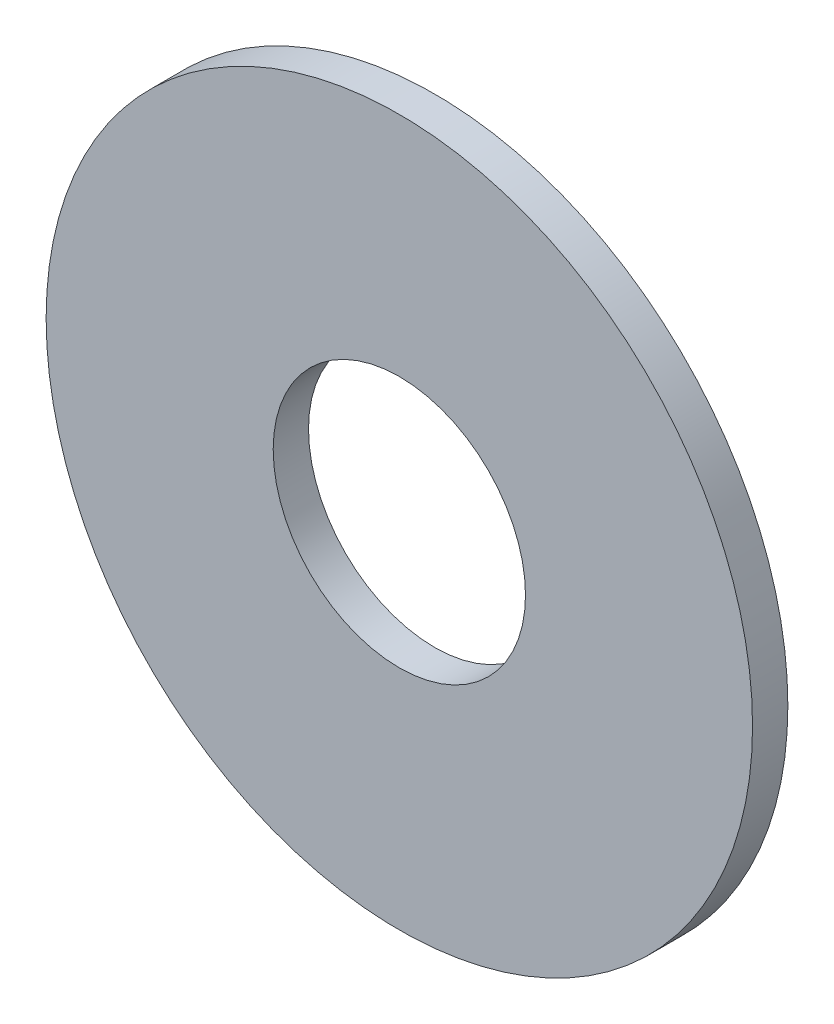
ISO-10303-21;
HEADER;
FILE_DESCRIPTION(('STEP AP214'),'2;1');
FILE_NAME('part.step','',(''),(''),'','','');
FILE_SCHEMA(('AUTOMOTIVE_DESIGN { 1 0 10303 214 1 1 1 1 }'));
ENDSEC;
DATA;
#1=APPLICATION_CONTEXT('core data for automotive mechanical design processes');
#2=APPLICATION_PROTOCOL_DEFINITION('international standard','automotive_design',2000,#1);
#3=PRODUCT_CONTEXT('',#1,'mechanical');
#4=PRODUCT('Part','Part','',(#3));
#5=PRODUCT_RELATED_PRODUCT_CATEGORY('part','',(#4));
#6=PRODUCT_DEFINITION_FORMATION('','',#4);
#7=PRODUCT_DEFINITION_CONTEXT('part definition',#1,'design');
#8=PRODUCT_DEFINITION('design','',#6,#7);
#9=PRODUCT_DEFINITION_SHAPE('','',#8);
#10=(LENGTH_UNIT() NAMED_UNIT(*) SI_UNIT(.MILLI.,.METRE.));
#11=(NAMED_UNIT(*) PLANE_ANGLE_UNIT() SI_UNIT($,.RADIAN.));
#12=(NAMED_UNIT(*) SI_UNIT($,.STERADIAN.) SOLID_ANGLE_UNIT());
#13=UNCERTAINTY_MEASURE_WITH_UNIT(LENGTH_MEASURE(1.E-05),#10,'distance_accuracy_value','');
#14=(GEOMETRIC_REPRESENTATION_CONTEXT(3) GLOBAL_UNCERTAINTY_ASSIGNED_CONTEXT((#13)) GLOBAL_UNIT_ASSIGNED_CONTEXT((#10,
#11,#12)) REPRESENTATION_CONTEXT('',''));
#15=CARTESIAN_POINT('',(0.,0.,0.));
#16=DIRECTION('',(0.,0.,1.));
#17=DIRECTION('',(1.,0.,0.));
#18=AXIS2_PLACEMENT_3D('',#15,#16,#17);
#19=CARTESIAN_POINT('',(148.05,-107.75,-0.045));
#20=DIRECTION('',(0.,0.,-1.));
#21=DIRECTION('',(0.,-1.,0.));
#22=AXIS2_PLACEMENT_3D('',#19,#20,#21);
#23=CYLINDRICAL_SURFACE('',#22,0.125);
#24=CARTESIAN_POINT('',(148.05,-107.75,-0.035));
#25=DIRECTION('',(0.,0.,-1.));
#26=DIRECTION('',(0.,-1.,0.));
#27=AXIS2_PLACEMENT_3D('',#24,#25,#26);
#28=CIRCLE('',#27,0.125);
#29=CARTESIAN_POINT('',(148.05,-107.875,-0.035));
#30=VERTEX_POINT('',#29);
#31=EDGE_CURVE('E20',#30,#30,#28,.T.);
#32=ORIENTED_EDGE('',*,*,#31,.T.);
#33=DIRECTION('',(0.,0.,1.));
#34=VECTOR('',#33,1.);
#35=CARTESIAN_POINT('',(148.05,-107.875,-0.045));
#36=LINE('',#35,#34);
#37=CARTESIAN_POINT('',(148.05,-107.875,0.));
#38=VERTEX_POINT('',#37);
#39=EDGE_CURVE('E11',#30,#38,#36,.T.);
#40=ORIENTED_EDGE('',*,*,#39,.T.);
#41=CARTESIAN_POINT('',(148.05,-107.75,0.));
#42=DIRECTION('',(0.,0.,-1.));
#43=DIRECTION('',(0.,-1.,0.));
#44=AXIS2_PLACEMENT_3D('',#41,#42,#43);
#45=CIRCLE('',#44,0.125);
#46=EDGE_CURVE('E66',#38,#38,#45,.T.);
#47=ORIENTED_EDGE('',*,*,#46,.F.);
#48=ORIENTED_EDGE('',*,*,#39,.F.);
#49=EDGE_LOOP('',(#32,#40,#47,#48));
#50=FACE_BOUND('',#49,.T.);
#51=ADVANCED_FACE('F17',(#50),#23,.F.);
#52=CARTESIAN_POINT('',(148.05,-107.75,-0.035));
#53=DIRECTION('',(0.,0.,1.));
#54=DIRECTION('',(1.,0.,0.));
#55=AXIS2_PLACEMENT_3D('',#52,#53,#54);
#56=PLANE('',#55);
#57=ORIENTED_EDGE('',*,*,#31,.F.);
#58=EDGE_LOOP('',(#57));
#59=FACE_BOUND('',#58,.T.);
#60=CARTESIAN_POINT('',(148.05,-107.75,-0.035));
#61=DIRECTION('',(0.,0.,1.));
#62=DIRECTION('',(1.,0.,0.));
#63=AXIS2_PLACEMENT_3D('',#60,#61,#62);
#64=CIRCLE('',#63,0.35);
#65=CARTESIAN_POINT('',(148.4,-107.75,-0.035));
#66=VERTEX_POINT('',#65);
#67=EDGE_CURVE('E55',#66,#66,#64,.T.);
#68=ORIENTED_EDGE('',*,*,#67,.F.);
#69=EDGE_LOOP('',(#68));
#70=FACE_BOUND('',#69,.T.);
#71=ADVANCED_FACE('F80',(#59,#70),#56,.F.);
#72=CARTESIAN_POINT('',(148.05,-107.75,0.));
#73=DIRECTION('',(0.,0.,1.));
#74=DIRECTION('',(1.,0.,0.));
#75=AXIS2_PLACEMENT_3D('',#72,#73,#74);
#76=PLANE('',#75);
#77=ORIENTED_EDGE('',*,*,#46,.T.);
#78=EDGE_LOOP('',(#77));
#79=FACE_BOUND('',#78,.T.);
#80=CARTESIAN_POINT('',(148.05,-107.75,0.));
#81=DIRECTION('',(0.,0.,1.));
#82=DIRECTION('',(1.,0.,0.));
#83=AXIS2_PLACEMENT_3D('',#80,#81,#82);
#84=CIRCLE('',#83,0.35);
#85=CARTESIAN_POINT('',(148.4,-107.75,0.));
#86=VERTEX_POINT('',#85);
#87=EDGE_CURVE('E53',#86,#86,#84,.T.);
#88=ORIENTED_EDGE('',*,*,#87,.T.);
#89=EDGE_LOOP('',(#88));
#90=FACE_BOUND('',#89,.T.);
#91=ADVANCED_FACE('F59',(#79,#90),#76,.T.);
#92=CARTESIAN_POINT('',(148.05,-107.75,-0.035));
#93=DIRECTION('',(0.,0.,1.));
#94=DIRECTION('',(1.,0.,0.));
#95=AXIS2_PLACEMENT_3D('',#92,#93,#94);
#96=CYLINDRICAL_SURFACE('',#95,0.35);
#97=ORIENTED_EDGE('',*,*,#87,.F.);
#98=DIRECTION('',(0.,0.,1.));
#99=VECTOR('',#98,1.);
#100=CARTESIAN_POINT('',(148.4,-107.75,-0.035));
#101=LINE('',#100,#99);
#102=EDGE_CURVE('E50',#66,#86,#101,.T.);
#103=ORIENTED_EDGE('',*,*,#102,.F.);
#104=ORIENTED_EDGE('',*,*,#67,.T.);
#105=ORIENTED_EDGE('',*,*,#102,.T.);
#106=EDGE_LOOP('',(#97,#103,#104,#105));
#107=FACE_BOUND('',#106,.T.);
#108=ADVANCED_FACE('F52',(#107),#96,.T.);
#109=CLOSED_SHELL('',(#51,#71,#91,#108));
#110=MANIFOLD_SOLID_BREP('B1',#109);
#111=ADVANCED_BREP_SHAPE_REPRESENTATION('',(#18,#110),#14);
#112=SHAPE_DEFINITION_REPRESENTATION(#9,#111);
ENDSEC;
END-ISO-10303-21;
